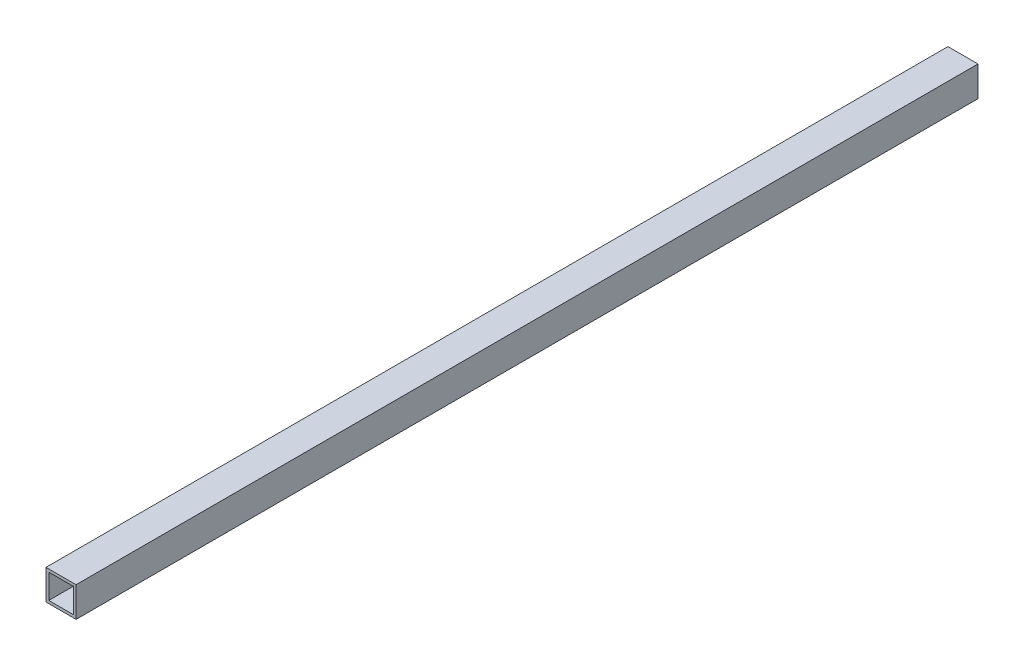
ISO-10303-21;
HEADER;
FILE_DESCRIPTION(('STEP AP214'),'2;1');
FILE_NAME('part.step','',(''),(''),'','','');
FILE_SCHEMA(('AUTOMOTIVE_DESIGN { 1 0 10303 214 1 1 1 1 }'));
ENDSEC;
DATA;
#1=APPLICATION_CONTEXT('core data for automotive mechanical design processes');
#2=APPLICATION_PROTOCOL_DEFINITION('international standard','automotive_design',2000,#1);
#3=PRODUCT_CONTEXT('',#1,'mechanical');
#4=PRODUCT('Part','Part','',(#3));
#5=PRODUCT_RELATED_PRODUCT_CATEGORY('part','',(#4));
#6=PRODUCT_DEFINITION_FORMATION('','',#4);
#7=PRODUCT_DEFINITION_CONTEXT('part definition',#1,'design');
#8=PRODUCT_DEFINITION('design','',#6,#7);
#9=PRODUCT_DEFINITION_SHAPE('','',#8);
#10=(LENGTH_UNIT() NAMED_UNIT(*) SI_UNIT(.MILLI.,.METRE.));
#11=(NAMED_UNIT(*) PLANE_ANGLE_UNIT() SI_UNIT($,.RADIAN.));
#12=(NAMED_UNIT(*) SI_UNIT($,.STERADIAN.) SOLID_ANGLE_UNIT());
#13=UNCERTAINTY_MEASURE_WITH_UNIT(LENGTH_MEASURE(1.E-05),#10,'distance_accuracy_value','');
#14=(GEOMETRIC_REPRESENTATION_CONTEXT(3) GLOBAL_UNCERTAINTY_ASSIGNED_CONTEXT((#13)) GLOBAL_UNIT_ASSIGNED_CONTEXT((#10,
#11,#12)) REPRESENTATION_CONTEXT('',''));
#15=CARTESIAN_POINT('',(0.,0.,0.));
#16=DIRECTION('',(0.,0.,1.));
#17=DIRECTION('',(1.,0.,0.));
#18=AXIS2_PLACEMENT_3D('',#15,#16,#17);
#19=CARTESIAN_POINT('',(0.,0.,300.));
#20=DIRECTION('',(0.,0.,1.));
#21=DIRECTION('',(1.,0.,0.));
#22=AXIS2_PLACEMENT_3D('',#19,#20,#21);
#23=PLANE('',#22);
#24=DIRECTION('',(0.,1.,0.));
#25=VECTOR('',#24,1.);
#26=CARTESIAN_POINT('',(5.,5.,300.));
#27=LINE('',#26,#25);
#28=CARTESIAN_POINT('',(5.,-5.,300.));
#29=VERTEX_POINT('',#28);
#30=CARTESIAN_POINT('',(5.,5.,300.));
#31=VERTEX_POINT('',#30);
#32=EDGE_CURVE('E140',#29,#31,#27,.T.);
#33=ORIENTED_EDGE('',*,*,#32,.T.);
#34=DIRECTION('',(-1.,0.,0.));
#35=VECTOR('',#34,1.);
#36=CARTESIAN_POINT('',(-5.,5.,300.));
#37=LINE('',#36,#35);
#38=CARTESIAN_POINT('',(-5.,5.,300.));
#39=VERTEX_POINT('',#38);
#40=EDGE_CURVE('E143',#31,#39,#37,.T.);
#41=ORIENTED_EDGE('',*,*,#40,.T.);
#42=DIRECTION('',(0.,-1.,0.));
#43=VECTOR('',#42,1.);
#44=CARTESIAN_POINT('',(-5.,5.,300.));
#45=LINE('',#44,#43);
#46=CARTESIAN_POINT('',(-5.,-5.,300.));
#47=VERTEX_POINT('',#46);
#48=EDGE_CURVE('E146',#39,#47,#45,.T.);
#49=ORIENTED_EDGE('',*,*,#48,.T.);
#50=DIRECTION('',(1.,0.,0.));
#51=VECTOR('',#50,1.);
#52=CARTESIAN_POINT('',(-5.,-5.,300.));
#53=LINE('',#52,#51);
#54=EDGE_CURVE('E148',#47,#29,#53,.T.);
#55=ORIENTED_EDGE('',*,*,#54,.T.);
#56=EDGE_LOOP('',(#33,#41,#49,#55));
#57=FACE_BOUND('',#56,.T.);
#58=DIRECTION('',(-1.,0.,0.));
#59=VECTOR('',#58,1.);
#60=CARTESIAN_POINT('',(-4.0834353233932,4.0834353233932,300.));
#61=LINE('',#60,#59);
#62=CARTESIAN_POINT('',(4.0834353233932,4.0834353233932,300.));
#63=VERTEX_POINT('',#62);
#64=CARTESIAN_POINT('',(-4.0834353233932,4.0834353233932,300.));
#65=VERTEX_POINT('',#64);
#66=EDGE_CURVE('E112',#63,#65,#61,.T.);
#67=ORIENTED_EDGE('',*,*,#66,.F.);
#68=DIRECTION('',(0.,1.,0.));
#69=VECTOR('',#68,1.);
#70=CARTESIAN_POINT('',(4.0834353233932,4.0834353233932,300.));
#71=LINE('',#70,#69);
#72=CARTESIAN_POINT('',(4.0834353233932,-4.0834353233932,300.));
#73=VERTEX_POINT('',#72);
#74=EDGE_CURVE('E104',#73,#63,#71,.T.);
#75=ORIENTED_EDGE('',*,*,#74,.F.);
#76=DIRECTION('',(1.,0.,0.));
#77=VECTOR('',#76,1.);
#78=CARTESIAN_POINT('',(-4.0834353233932,-4.0834353233932,300.));
#79=LINE('',#78,#77);
#80=CARTESIAN_POINT('',(-4.0834353233932,-4.0834353233932,300.));
#81=VERTEX_POINT('',#80);
#82=EDGE_CURVE('E126',#81,#73,#79,.T.);
#83=ORIENTED_EDGE('',*,*,#82,.F.);
#84=DIRECTION('',(0.,-1.,0.));
#85=VECTOR('',#84,1.);
#86=CARTESIAN_POINT('',(-4.0834353233932,4.0834353233932,300.));
#87=LINE('',#86,#85);
#88=EDGE_CURVE('E124',#65,#81,#87,.T.);
#89=ORIENTED_EDGE('',*,*,#88,.F.);
#90=EDGE_LOOP('',(#67,#75,#83,#89));
#91=FACE_BOUND('',#90,.T.);
#92=ADVANCED_FACE('F39',(#57,#91),#23,.T.);
#93=CARTESIAN_POINT('',(0.,0.,0.));
#94=DIRECTION('',(0.,0.,1.));
#95=DIRECTION('',(1.,0.,0.));
#96=AXIS2_PLACEMENT_3D('',#93,#94,#95);
#97=PLANE('',#96);
#98=DIRECTION('',(0.,1.,0.));
#99=VECTOR('',#98,1.);
#100=CARTESIAN_POINT('',(5.,5.,0.));
#101=LINE('',#100,#99);
#102=CARTESIAN_POINT('',(5.,-5.,0.));
#103=VERTEX_POINT('',#102);
#104=CARTESIAN_POINT('',(5.,5.,0.));
#105=VERTEX_POINT('',#104);
#106=EDGE_CURVE('E120',#103,#105,#101,.T.);
#107=ORIENTED_EDGE('',*,*,#106,.F.);
#108=DIRECTION('',(1.,0.,0.));
#109=VECTOR('',#108,1.);
#110=CARTESIAN_POINT('',(-5.,-5.,0.));
#111=LINE('',#110,#109);
#112=CARTESIAN_POINT('',(-5.,-5.,0.));
#113=VERTEX_POINT('',#112);
#114=EDGE_CURVE('E144',#113,#103,#111,.T.);
#115=ORIENTED_EDGE('',*,*,#114,.F.);
#116=DIRECTION('',(0.,-1.,0.));
#117=VECTOR('',#116,1.);
#118=CARTESIAN_POINT('',(-5.,5.,0.));
#119=LINE('',#118,#117);
#120=CARTESIAN_POINT('',(-5.,5.,0.));
#121=VERTEX_POINT('',#120);
#122=EDGE_CURVE('E155',#121,#113,#119,.T.);
#123=ORIENTED_EDGE('',*,*,#122,.F.);
#124=DIRECTION('',(-1.,0.,0.));
#125=VECTOR('',#124,1.);
#126=CARTESIAN_POINT('',(-5.,5.,0.));
#127=LINE('',#126,#125);
#128=EDGE_CURVE('E153',#105,#121,#127,.T.);
#129=ORIENTED_EDGE('',*,*,#128,.F.);
#130=EDGE_LOOP('',(#107,#115,#123,#129));
#131=FACE_BOUND('',#130,.T.);
#132=DIRECTION('',(0.,1.,0.));
#133=VECTOR('',#132,1.);
#134=CARTESIAN_POINT('',(4.0834353233932,4.0834353233932,0.));
#135=LINE('',#134,#133);
#136=CARTESIAN_POINT('',(4.0834353233932,-4.0834353233932,0.));
#137=VERTEX_POINT('',#136);
#138=CARTESIAN_POINT('',(4.0834353233932,4.0834353233932,0.));
#139=VERTEX_POINT('',#138);
#140=EDGE_CURVE('E62',#137,#139,#135,.T.);
#141=ORIENTED_EDGE('',*,*,#140,.T.);
#142=DIRECTION('',(-1.,0.,0.));
#143=VECTOR('',#142,1.);
#144=CARTESIAN_POINT('',(-4.0834353233932,4.0834353233932,0.));
#145=LINE('',#144,#143);
#146=CARTESIAN_POINT('',(-4.0834353233932,4.0834353233932,0.));
#147=VERTEX_POINT('',#146);
#148=EDGE_CURVE('E119',#139,#147,#145,.T.);
#149=ORIENTED_EDGE('',*,*,#148,.T.);
#150=DIRECTION('',(0.,-1.,0.));
#151=VECTOR('',#150,1.);
#152=CARTESIAN_POINT('',(-4.0834353233932,4.0834353233932,0.));
#153=LINE('',#152,#151);
#154=CARTESIAN_POINT('',(-4.0834353233932,-4.0834353233932,0.));
#155=VERTEX_POINT('',#154);
#156=EDGE_CURVE('E132',#147,#155,#153,.T.);
#157=ORIENTED_EDGE('',*,*,#156,.T.);
#158=DIRECTION('',(1.,0.,0.));
#159=VECTOR('',#158,1.);
#160=CARTESIAN_POINT('',(-4.0834353233932,-4.0834353233932,0.));
#161=LINE('',#160,#159);
#162=EDGE_CURVE('E113',#155,#137,#161,.T.);
#163=ORIENTED_EDGE('',*,*,#162,.T.);
#164=EDGE_LOOP('',(#141,#149,#157,#163));
#165=FACE_BOUND('',#164,.T.);
#166=ADVANCED_FACE('F173',(#131,#165),#97,.F.);
#167=CARTESIAN_POINT('',(5.,5.,300.));
#168=DIRECTION('',(-1.,0.,0.));
#169=DIRECTION('',(0.,-1.,0.));
#170=AXIS2_PLACEMENT_3D('',#167,#168,#169);
#171=PLANE('',#170);
#172=ORIENTED_EDGE('',*,*,#106,.T.);
#173=DIRECTION('',(0.,0.,-1.));
#174=VECTOR('',#173,1.);
#175=CARTESIAN_POINT('',(5.,5.,300.));
#176=LINE('',#175,#174);
#177=EDGE_CURVE('E11',#31,#105,#176,.T.);
#178=ORIENTED_EDGE('',*,*,#177,.F.);
#179=ORIENTED_EDGE('',*,*,#32,.F.);
#180=DIRECTION('',(0.,0.,-1.));
#181=VECTOR('',#180,1.);
#182=CARTESIAN_POINT('',(5.,-5.,300.));
#183=LINE('',#182,#181);
#184=EDGE_CURVE('E150',#29,#103,#183,.T.);
#185=ORIENTED_EDGE('',*,*,#184,.T.);
#186=EDGE_LOOP('',(#172,#178,#179,#185));
#187=FACE_BOUND('',#186,.T.);
#188=ADVANCED_FACE('F41',(#187),#171,.F.);
#189=CARTESIAN_POINT('',(-5.,5.,300.));
#190=DIRECTION('',(0.,-1.,0.));
#191=DIRECTION('',(0.,0.,-1.));
#192=AXIS2_PLACEMENT_3D('',#189,#190,#191);
#193=PLANE('',#192);
#194=ORIENTED_EDGE('',*,*,#128,.T.);
#195=DIRECTION('',(0.,0.,-1.));
#196=VECTOR('',#195,1.);
#197=CARTESIAN_POINT('',(-5.,5.,300.));
#198=LINE('',#197,#196);
#199=EDGE_CURVE('E47',#39,#121,#198,.T.);
#200=ORIENTED_EDGE('',*,*,#199,.F.);
#201=ORIENTED_EDGE('',*,*,#40,.F.);
#202=ORIENTED_EDGE('',*,*,#177,.T.);
#203=EDGE_LOOP('',(#194,#200,#201,#202));
#204=FACE_BOUND('',#203,.T.);
#205=ADVANCED_FACE('F183',(#204),#193,.F.);
#206=CARTESIAN_POINT('',(-5.,5.,300.));
#207=DIRECTION('',(1.,0.,0.));
#208=DIRECTION('',(0.,1.,0.));
#209=AXIS2_PLACEMENT_3D('',#206,#207,#208);
#210=PLANE('',#209);
#211=ORIENTED_EDGE('',*,*,#122,.T.);
#212=DIRECTION('',(0.,0.,-1.));
#213=VECTOR('',#212,1.);
#214=CARTESIAN_POINT('',(-5.,-5.,300.));
#215=LINE('',#214,#213);
#216=EDGE_CURVE('E160',#47,#113,#215,.T.);
#217=ORIENTED_EDGE('',*,*,#216,.F.);
#218=ORIENTED_EDGE('',*,*,#48,.F.);
#219=ORIENTED_EDGE('',*,*,#199,.T.);
#220=EDGE_LOOP('',(#211,#217,#218,#219));
#221=FACE_BOUND('',#220,.T.);
#222=ADVANCED_FACE('F167',(#221),#210,.F.);
#223=CARTESIAN_POINT('',(-5.,-5.,300.));
#224=DIRECTION('',(0.,1.,0.));
#225=DIRECTION('',(0.,0.,1.));
#226=AXIS2_PLACEMENT_3D('',#223,#224,#225);
#227=PLANE('',#226);
#228=ORIENTED_EDGE('',*,*,#114,.T.);
#229=ORIENTED_EDGE('',*,*,#184,.F.);
#230=ORIENTED_EDGE('',*,*,#54,.F.);
#231=ORIENTED_EDGE('',*,*,#216,.T.);
#232=EDGE_LOOP('',(#228,#229,#230,#231));
#233=FACE_BOUND('',#232,.T.);
#234=ADVANCED_FACE('F177',(#233),#227,.F.);
#235=CARTESIAN_POINT('',(4.0834353233932,4.0834353233932,300.));
#236=DIRECTION('',(-1.,0.,0.));
#237=DIRECTION('',(0.,0.,1.));
#238=AXIS2_PLACEMENT_3D('',#235,#236,#237);
#239=PLANE('',#238);
#240=ORIENTED_EDGE('',*,*,#140,.F.);
#241=DIRECTION('',(0.,0.,-1.));
#242=VECTOR('',#241,1.);
#243=CARTESIAN_POINT('',(4.0834353233932,-4.0834353233932,300.));
#244=LINE('',#243,#242);
#245=EDGE_CURVE('E108',#73,#137,#244,.T.);
#246=ORIENTED_EDGE('',*,*,#245,.F.);
#247=ORIENTED_EDGE('',*,*,#74,.T.);
#248=DIRECTION('',(0.,0.,-1.));
#249=VECTOR('',#248,1.);
#250=CARTESIAN_POINT('',(4.0834353233932,4.0834353233932,300.));
#251=LINE('',#250,#249);
#252=EDGE_CURVE('E107',#63,#139,#251,.T.);
#253=ORIENTED_EDGE('',*,*,#252,.T.);
#254=EDGE_LOOP('',(#240,#246,#247,#253));
#255=FACE_BOUND('',#254,.T.);
#256=ADVANCED_FACE('F106',(#255),#239,.T.);
#257=CARTESIAN_POINT('',(-4.0834353233932,4.0834353233932,300.));
#258=DIRECTION('',(0.,-1.,0.));
#259=DIRECTION('',(0.,0.,-1.));
#260=AXIS2_PLACEMENT_3D('',#257,#258,#259);
#261=PLANE('',#260);
#262=ORIENTED_EDGE('',*,*,#148,.F.);
#263=ORIENTED_EDGE('',*,*,#252,.F.);
#264=ORIENTED_EDGE('',*,*,#66,.T.);
#265=DIRECTION('',(0.,0.,-1.));
#266=VECTOR('',#265,1.);
#267=CARTESIAN_POINT('',(-4.0834353233932,4.0834353233932,300.));
#268=LINE('',#267,#266);
#269=EDGE_CURVE('E121',#65,#147,#268,.T.);
#270=ORIENTED_EDGE('',*,*,#269,.T.);
#271=EDGE_LOOP('',(#262,#263,#264,#270));
#272=FACE_BOUND('',#271,.T.);
#273=ADVANCED_FACE('F116',(#272),#261,.T.);
#274=CARTESIAN_POINT('',(-4.0834353233932,4.0834353233932,300.));
#275=DIRECTION('',(1.,0.,0.));
#276=DIRECTION('',(0.,0.,-1.));
#277=AXIS2_PLACEMENT_3D('',#274,#275,#276);
#278=PLANE('',#277);
#279=ORIENTED_EDGE('',*,*,#156,.F.);
#280=ORIENTED_EDGE('',*,*,#269,.F.);
#281=ORIENTED_EDGE('',*,*,#88,.T.);
#282=DIRECTION('',(0.,0.,-1.));
#283=VECTOR('',#282,1.);
#284=CARTESIAN_POINT('',(-4.0834353233932,-4.0834353233932,300.));
#285=LINE('',#284,#283);
#286=EDGE_CURVE('E54',#81,#155,#285,.T.);
#287=ORIENTED_EDGE('',*,*,#286,.T.);
#288=EDGE_LOOP('',(#279,#280,#281,#287));
#289=FACE_BOUND('',#288,.T.);
#290=ADVANCED_FACE('F206',(#289),#278,.T.);
#291=CARTESIAN_POINT('',(-4.0834353233932,-4.0834353233932,300.));
#292=DIRECTION('',(0.,1.,0.));
#293=DIRECTION('',(0.,0.,1.));
#294=AXIS2_PLACEMENT_3D('',#291,#292,#293);
#295=PLANE('',#294);
#296=ORIENTED_EDGE('',*,*,#162,.F.);
#297=ORIENTED_EDGE('',*,*,#286,.F.);
#298=ORIENTED_EDGE('',*,*,#82,.T.);
#299=ORIENTED_EDGE('',*,*,#245,.T.);
#300=EDGE_LOOP('',(#296,#297,#298,#299));
#301=FACE_BOUND('',#300,.T.);
#302=ADVANCED_FACE('F210',(#301),#295,.T.);
#303=CLOSED_SHELL('',(#92,#166,#188,#205,#222,#234,#256,#273,#290,#302));
#304=MANIFOLD_SOLID_BREP('B2',#303);
#305=ADVANCED_BREP_SHAPE_REPRESENTATION('',(#18,#304),#14);
#306=SHAPE_DEFINITION_REPRESENTATION(#9,#305);
ENDSEC;
END-ISO-10303-21;
